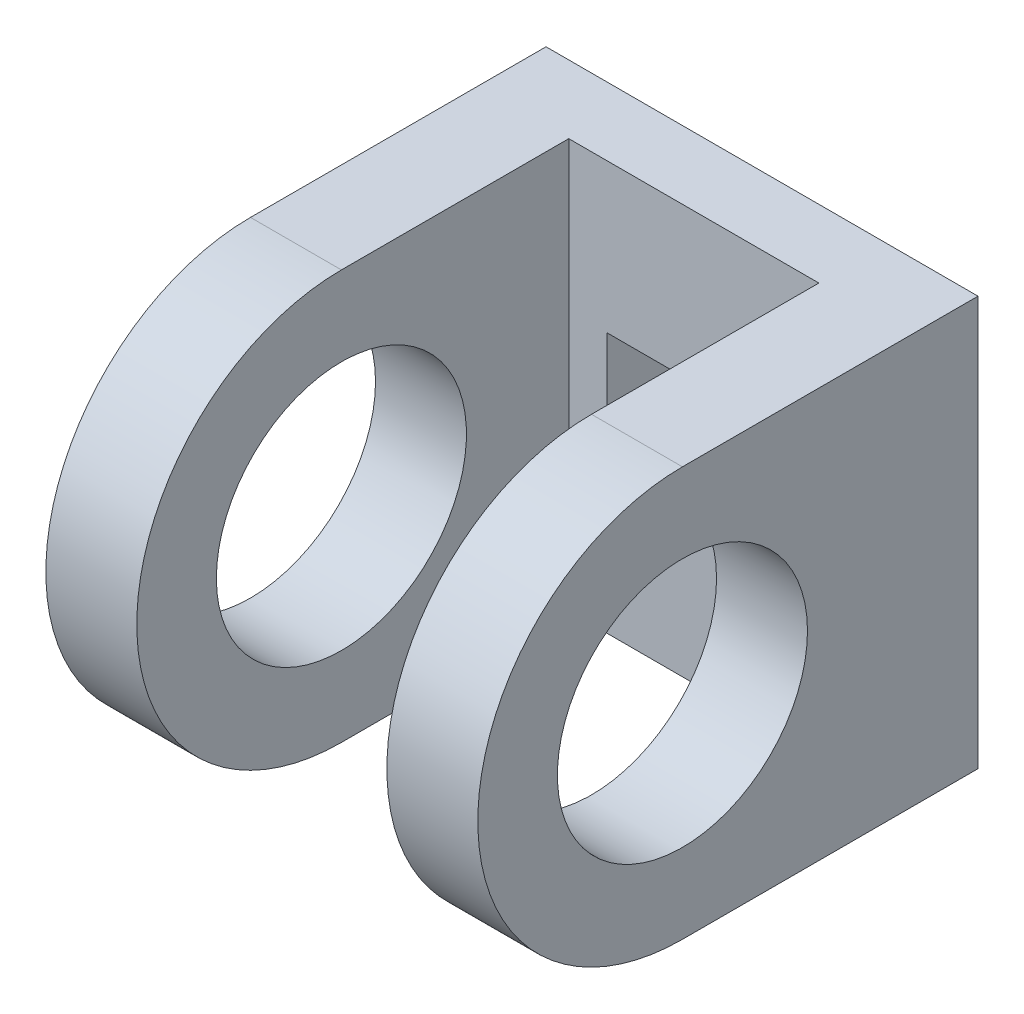
ISO-10303-21;
HEADER;
FILE_DESCRIPTION(('STEP AP214'),'2;1');
FILE_NAME('part.step','',(''),(''),'','','');
FILE_SCHEMA(('AUTOMOTIVE_DESIGN { 1 0 10303 214 1 1 1 1 }'));
ENDSEC;
DATA;
#1=APPLICATION_CONTEXT('core data for automotive mechanical design processes');
#2=APPLICATION_PROTOCOL_DEFINITION('international standard','automotive_design',2000,#1);
#3=PRODUCT_CONTEXT('',#1,'mechanical');
#4=PRODUCT('Part','Part','',(#3));
#5=PRODUCT_RELATED_PRODUCT_CATEGORY('part','',(#4));
#6=PRODUCT_DEFINITION_FORMATION('','',#4);
#7=PRODUCT_DEFINITION_CONTEXT('part definition',#1,'design');
#8=PRODUCT_DEFINITION('design','',#6,#7);
#9=PRODUCT_DEFINITION_SHAPE('','',#8);
#10=(LENGTH_UNIT() NAMED_UNIT(*) SI_UNIT(.MILLI.,.METRE.));
#11=(NAMED_UNIT(*) PLANE_ANGLE_UNIT() SI_UNIT($,.RADIAN.));
#12=(NAMED_UNIT(*) SI_UNIT($,.STERADIAN.) SOLID_ANGLE_UNIT());
#13=UNCERTAINTY_MEASURE_WITH_UNIT(LENGTH_MEASURE(1.E-05),#10,'distance_accuracy_value','');
#14=(GEOMETRIC_REPRESENTATION_CONTEXT(3) GLOBAL_UNCERTAINTY_ASSIGNED_CONTEXT((#13)) GLOBAL_UNIT_ASSIGNED_CONTEXT((#10,
#11,#12)) REPRESENTATION_CONTEXT('',''));
#15=CARTESIAN_POINT('',(0.,0.,0.));
#16=DIRECTION('',(0.,0.,1.));
#17=DIRECTION('',(1.,0.,0.));
#18=AXIS2_PLACEMENT_3D('',#15,#16,#17);
#19=CARTESIAN_POINT('',(19.,0.,1.99999952316284));
#20=DIRECTION('',(-1.,0.,0.));
#21=DIRECTION('',(0.,0.,1.));
#22=AXIS2_PLACEMENT_3D('',#19,#20,#21);
#23=CYLINDRICAL_SURFACE('',#22,9.00000095367432);
#24=CARTESIAN_POINT('',(4.,0.,1.99999952316284));
#25=DIRECTION('',(-1.,0.,0.));
#26=DIRECTION('',(0.,0.,1.));
#27=AXIS2_PLACEMENT_3D('',#24,#25,#26);
#28=CIRCLE('',#27,9.00000095367432);
#29=CARTESIAN_POINT('',(4.,-9.00000095367432,1.99999952316284));
#30=VERTEX_POINT('',#29);
#31=CARTESIAN_POINT('',(4.,9.00000095367431,1.99999952316284));
#32=VERTEX_POINT('',#31);
#33=EDGE_CURVE('E189',#30,#32,#28,.T.);
#34=ORIENTED_EDGE('',*,*,#33,.T.);
#35=DIRECTION('',(-1.,0.,0.));
#36=VECTOR('',#35,1.);
#37=CARTESIAN_POINT('',(19.,9.00000095367431,1.99999952316284));
#38=LINE('',#37,#36);
#39=CARTESIAN_POINT('',(0.,9.00000095367431,1.99999952316284));
#40=VERTEX_POINT('',#39);
#41=EDGE_CURVE('E211',#32,#40,#38,.T.);
#42=ORIENTED_EDGE('',*,*,#41,.T.);
#43=CARTESIAN_POINT('',(0.,0.,1.99999952316284));
#44=DIRECTION('',(1.,0.,0.));
#45=DIRECTION('',(0.,0.,1.));
#46=AXIS2_PLACEMENT_3D('',#43,#44,#45);
#47=CIRCLE('',#46,9.00000095367432);
#48=CARTESIAN_POINT('',(0.,-9.00000095367432,1.99999952316284));
#49=VERTEX_POINT('',#48);
#50=EDGE_CURVE('E198',#40,#49,#47,.T.);
#51=ORIENTED_EDGE('',*,*,#50,.T.);
#52=DIRECTION('',(-1.,0.,0.));
#53=VECTOR('',#52,1.);
#54=CARTESIAN_POINT('',(19.,-9.00000095367432,1.99999952316284));
#55=LINE('',#54,#53);
#56=EDGE_CURVE('E48',#30,#49,#55,.T.);
#57=ORIENTED_EDGE('',*,*,#56,.F.);
#58=EDGE_LOOP('',(#34,#42,#51,#57));
#59=FACE_BOUND('',#58,.T.);
#60=ADVANCED_FACE('F39',(#59),#23,.T.);
#61=CARTESIAN_POINT('',(19.,0.,1.99999952316284));
#62=DIRECTION('',(-1.,0.,0.));
#63=DIRECTION('',(0.,0.,1.));
#64=AXIS2_PLACEMENT_3D('',#61,#62,#63);
#65=CYLINDRICAL_SURFACE('',#64,5.49999903647999);
#66=CARTESIAN_POINT('',(4.,0.,1.99999952316284));
#67=DIRECTION('',(-1.,0.,0.));
#68=DIRECTION('',(0.,0.,1.));
#69=AXIS2_PLACEMENT_3D('',#66,#67,#68);
#70=CIRCLE('',#69,5.49999903647999);
#71=CARTESIAN_POINT('',(4.,0.,7.49999855964283));
#72=VERTEX_POINT('',#71);
#73=EDGE_CURVE('E43',#72,#72,#70,.T.);
#74=ORIENTED_EDGE('',*,*,#73,.F.);
#75=EDGE_LOOP('',(#74));
#76=FACE_BOUND('',#75,.T.);
#77=CARTESIAN_POINT('',(0.,0.,1.99999952316284));
#78=DIRECTION('',(1.,0.,0.));
#79=DIRECTION('',(0.,0.,-1.));
#80=AXIS2_PLACEMENT_3D('',#77,#78,#79);
#81=CIRCLE('',#80,5.49999903647999);
#82=CARTESIAN_POINT('',(0.,0.,-3.49999951331714));
#83=VERTEX_POINT('',#82);
#84=EDGE_CURVE('E194',#83,#83,#81,.T.);
#85=ORIENTED_EDGE('',*,*,#84,.F.);
#86=EDGE_LOOP('',(#85));
#87=FACE_BOUND('',#86,.T.);
#88=ADVANCED_FACE('F239',(#76,#87),#65,.F.);
#89=CARTESIAN_POINT('',(19.,0.,1.99999952316284));
#90=DIRECTION('',(-1.,0.,0.));
#91=DIRECTION('',(0.,0.,1.));
#92=AXIS2_PLACEMENT_3D('',#89,#90,#91);
#93=PLANE('',#92);
#94=CARTESIAN_POINT('',(19.,0.,1.99999952316284));
#95=DIRECTION('',(1.,0.,0.));
#96=DIRECTION('',(0.,0.,1.));
#97=AXIS2_PLACEMENT_3D('',#94,#95,#96);
#98=CIRCLE('',#97,9.00000095367432);
#99=CARTESIAN_POINT('',(19.,9.00000095367431,1.99999952316284));
#100=VERTEX_POINT('',#99);
#101=CARTESIAN_POINT('',(19.,-9.00000095367432,1.99999952316284));
#102=VERTEX_POINT('',#101);
#103=EDGE_CURVE('E201',#100,#102,#98,.T.);
#104=ORIENTED_EDGE('',*,*,#103,.T.);
#105=DIRECTION('',(0.,0.,-1.));
#106=VECTOR('',#105,1.);
#107=CARTESIAN_POINT('',(19.,-9.00000095367432,-11.0000004768372));
#108=LINE('',#107,#106);
#109=CARTESIAN_POINT('',(19.,-9.00000095367432,-11.0000004768372));
#110=VERTEX_POINT('',#109);
#111=EDGE_CURVE('E204',#102,#110,#108,.T.);
#112=ORIENTED_EDGE('',*,*,#111,.T.);
#113=DIRECTION('',(0.,1.,0.));
#114=VECTOR('',#113,1.);
#115=CARTESIAN_POINT('',(19.,9.00000095367431,-11.0000004768372));
#116=LINE('',#115,#114);
#117=CARTESIAN_POINT('',(19.,9.00000095367431,-11.0000004768372));
#118=VERTEX_POINT('',#117);
#119=EDGE_CURVE('E207',#110,#118,#116,.T.);
#120=ORIENTED_EDGE('',*,*,#119,.T.);
#121=DIRECTION('',(0.,0.,1.));
#122=VECTOR('',#121,1.);
#123=CARTESIAN_POINT('',(19.,9.00000095367431,1.99999952316284));
#124=LINE('',#123,#122);
#125=EDGE_CURVE('E209',#118,#100,#124,.T.);
#126=ORIENTED_EDGE('',*,*,#125,.T.);
#127=EDGE_LOOP('',(#104,#112,#120,#126));
#128=FACE_BOUND('',#127,.T.);
#129=CARTESIAN_POINT('',(19.,0.,1.99999952316284));
#130=DIRECTION('',(1.,0.,0.));
#131=DIRECTION('',(0.,0.,-1.));
#132=AXIS2_PLACEMENT_3D('',#129,#130,#131);
#133=CIRCLE('',#132,5.49999903647999);
#134=CARTESIAN_POINT('',(19.,0.,-3.49999951331714));
#135=VERTEX_POINT('',#134);
#136=EDGE_CURVE('E195',#135,#135,#133,.T.);
#137=ORIENTED_EDGE('',*,*,#136,.F.);
#138=EDGE_LOOP('',(#137));
#139=FACE_BOUND('',#138,.T.);
#140=ADVANCED_FACE('F242',(#128,#139),#93,.F.);
#141=CARTESIAN_POINT('',(0.,0.,1.99999952316284));
#142=DIRECTION('',(-1.,0.,0.));
#143=DIRECTION('',(0.,0.,1.));
#144=AXIS2_PLACEMENT_3D('',#141,#142,#143);
#145=PLANE('',#144);
#146=ORIENTED_EDGE('',*,*,#50,.F.);
#147=DIRECTION('',(0.,0.,1.));
#148=VECTOR('',#147,1.);
#149=CARTESIAN_POINT('',(0.,9.00000095367431,1.99999952316284));
#150=LINE('',#149,#148);
#151=CARTESIAN_POINT('',(0.,9.00000095367431,-11.0000004768372));
#152=VERTEX_POINT('',#151);
#153=EDGE_CURVE('E205',#152,#40,#150,.T.);
#154=ORIENTED_EDGE('',*,*,#153,.F.);
#155=DIRECTION('',(0.,1.,0.));
#156=VECTOR('',#155,1.);
#157=CARTESIAN_POINT('',(0.,9.00000095367431,-11.0000004768372));
#158=LINE('',#157,#156);
#159=CARTESIAN_POINT('',(0.,-9.00000095367432,-11.0000004768372));
#160=VERTEX_POINT('',#159);
#161=EDGE_CURVE('E216',#160,#152,#158,.T.);
#162=ORIENTED_EDGE('',*,*,#161,.F.);
#163=DIRECTION('',(0.,0.,-1.));
#164=VECTOR('',#163,1.);
#165=CARTESIAN_POINT('',(0.,-9.00000095367432,-11.0000004768372));
#166=LINE('',#165,#164);
#167=EDGE_CURVE('E214',#49,#160,#166,.T.);
#168=ORIENTED_EDGE('',*,*,#167,.F.);
#169=EDGE_LOOP('',(#146,#154,#162,#168));
#170=FACE_BOUND('',#169,.T.);
#171=ORIENTED_EDGE('',*,*,#84,.T.);
#172=EDGE_LOOP('',(#171));
#173=FACE_BOUND('',#172,.T.);
#174=ADVANCED_FACE('F244',(#170,#173),#145,.T.);
#175=CARTESIAN_POINT('',(15.,9.00000095367431,1.99999952316284));
#176=VERTEX_POINT('',#175);
#177=EDGE_CURVE('E220',#100,#176,#38,.T.);
#178=ORIENTED_EDGE('',*,*,#177,.T.);
#179=CARTESIAN_POINT('',(15.,0.,1.99999952316284));
#180=DIRECTION('',(1.,0.,0.));
#181=DIRECTION('',(0.,0.,-1.));
#182=AXIS2_PLACEMENT_3D('',#179,#180,#181);
#183=CIRCLE('',#182,9.00000095367432);
#184=CARTESIAN_POINT('',(15.,-9.00000095367432,1.99999952316284));
#185=VERTEX_POINT('',#184);
#186=EDGE_CURVE('E184',#176,#185,#183,.T.);
#187=ORIENTED_EDGE('',*,*,#186,.T.);
#188=EDGE_CURVE('E11',#102,#185,#55,.T.);
#189=ORIENTED_EDGE('',*,*,#188,.F.);
#190=ORIENTED_EDGE('',*,*,#103,.F.);
#191=EDGE_LOOP('',(#178,#187,#189,#190));
#192=FACE_BOUND('',#191,.T.);
#193=ADVANCED_FACE('F41',(#192),#23,.T.);
#194=CARTESIAN_POINT('',(19.,-9.00000095367432,-11.0000004768372));
#195=DIRECTION('',(0.,1.,0.));
#196=DIRECTION('',(0.,0.,1.));
#197=AXIS2_PLACEMENT_3D('',#194,#195,#196);
#198=PLANE('',#197);
#199=DIRECTION('',(-1.,0.,0.));
#200=VECTOR('',#199,1.);
#201=CARTESIAN_POINT('',(19.,-9.00000095367432,-7.99999952316284));
#202=LINE('',#201,#200);
#203=CARTESIAN_POINT('',(15.,-9.00000095367432,-7.99999952316284));
#204=VERTEX_POINT('',#203);
#205=CARTESIAN_POINT('',(4.,-9.00000095367432,-7.99999952316284));
#206=VERTEX_POINT('',#205);
#207=EDGE_CURVE('E191',#204,#206,#202,.T.);
#208=ORIENTED_EDGE('',*,*,#207,.T.);
#209=DIRECTION('',(0.,0.,1.));
#210=VECTOR('',#209,1.);
#211=CARTESIAN_POINT('',(4.,-9.00000095367432,-11.0000004768372));
#212=LINE('',#211,#210);
#213=EDGE_CURVE('E186',#206,#30,#212,.T.);
#214=ORIENTED_EDGE('',*,*,#213,.T.);
#215=ORIENTED_EDGE('',*,*,#56,.T.);
#216=ORIENTED_EDGE('',*,*,#167,.T.);
#217=DIRECTION('',(-1.,0.,0.));
#218=VECTOR('',#217,1.);
#219=CARTESIAN_POINT('',(19.,-9.00000095367432,-11.0000004768372));
#220=LINE('',#219,#218);
#221=EDGE_CURVE('E226',#110,#160,#220,.T.);
#222=ORIENTED_EDGE('',*,*,#221,.F.);
#223=ORIENTED_EDGE('',*,*,#111,.F.);
#224=ORIENTED_EDGE('',*,*,#188,.T.);
#225=DIRECTION('',(0.,0.,-1.));
#226=VECTOR('',#225,1.);
#227=CARTESIAN_POINT('',(15.,-9.00000095367432,-11.0000004768372));
#228=LINE('',#227,#226);
#229=EDGE_CURVE('E181',#185,#204,#228,.T.);
#230=ORIENTED_EDGE('',*,*,#229,.T.);
#231=EDGE_LOOP('',(#208,#214,#215,#216,#222,#223,#224,#230));
#232=FACE_BOUND('',#231,.T.);
#233=ADVANCED_FACE('F259',(#232),#198,.F.);
#234=CARTESIAN_POINT('',(19.,9.00000095367431,-11.0000004768372));
#235=DIRECTION('',(0.,0.,1.));
#236=DIRECTION('',(0.,-1.,0.));
#237=AXIS2_PLACEMENT_3D('',#234,#235,#236);
#238=PLANE('',#237);
#239=DIRECTION('',(-1.,0.,0.));
#240=VECTOR('',#239,1.);
#241=CARTESIAN_POINT('',(19.,2.44641040240358,-11.0000004768372));
#242=LINE('',#241,#240);
#243=CARTESIAN_POINT('',(13.2754317919568,2.44641040240358,-11.0000004768372));
#244=VERTEX_POINT('',#243);
#245=CARTESIAN_POINT('',(5.67718650457361,2.44641040240358,-11.0000004768372));
#246=VERTEX_POINT('',#245);
#247=EDGE_CURVE('E161',#244,#246,#242,.T.);
#248=ORIENTED_EDGE('',*,*,#247,.T.);
#249=DIRECTION('',(0.,-1.,0.));
#250=VECTOR('',#249,1.);
#251=CARTESIAN_POINT('',(5.67718650457362,9.00000095367432,-11.0000004768372));
#252=LINE('',#251,#250);
#253=CARTESIAN_POINT('',(5.67718650457361,-2.47010125413847,-11.0000004768372));
#254=VERTEX_POINT('',#253);
#255=EDGE_CURVE('E164',#246,#254,#252,.T.);
#256=ORIENTED_EDGE('',*,*,#255,.T.);
#257=DIRECTION('',(1.,0.,0.));
#258=VECTOR('',#257,1.);
#259=CARTESIAN_POINT('',(19.,-2.47010125413847,-11.0000004768372));
#260=LINE('',#259,#258);
#261=CARTESIAN_POINT('',(13.2754317919568,-2.47010125413847,-11.0000004768372));
#262=VERTEX_POINT('',#261);
#263=EDGE_CURVE('E156',#254,#262,#260,.T.);
#264=ORIENTED_EDGE('',*,*,#263,.T.);
#265=DIRECTION('',(0.,1.,0.));
#266=VECTOR('',#265,1.);
#267=CARTESIAN_POINT('',(13.2754317919568,9.00000095367431,-11.0000004768372));
#268=LINE('',#267,#266);
#269=EDGE_CURVE('E136',#262,#244,#268,.T.);
#270=ORIENTED_EDGE('',*,*,#269,.T.);
#271=EDGE_LOOP('',(#248,#256,#264,#270));
#272=FACE_BOUND('',#271,.T.);
#273=ORIENTED_EDGE('',*,*,#161,.T.);
#274=DIRECTION('',(-1.,0.,0.));
#275=VECTOR('',#274,1.);
#276=CARTESIAN_POINT('',(19.,9.00000095367431,-11.0000004768372));
#277=LINE('',#276,#275);
#278=EDGE_CURVE('E223',#118,#152,#277,.T.);
#279=ORIENTED_EDGE('',*,*,#278,.F.);
#280=ORIENTED_EDGE('',*,*,#119,.F.);
#281=ORIENTED_EDGE('',*,*,#221,.T.);
#282=EDGE_LOOP('',(#273,#279,#280,#281));
#283=FACE_BOUND('',#282,.T.);
#284=ADVANCED_FACE('F264',(#272,#283),#238,.F.);
#285=CARTESIAN_POINT('',(19.,9.00000095367431,1.99999952316284));
#286=DIRECTION('',(0.,-1.,0.));
#287=DIRECTION('',(0.,0.,-1.));
#288=AXIS2_PLACEMENT_3D('',#285,#286,#287);
#289=PLANE('',#288);
#290=ORIENTED_EDGE('',*,*,#41,.F.);
#291=DIRECTION('',(0.,0.,1.));
#292=VECTOR('',#291,1.);
#293=CARTESIAN_POINT('',(4.,9.00000095367431,11.0000004768372));
#294=LINE('',#293,#292);
#295=CARTESIAN_POINT('',(4.,9.00000095367431,-7.99999952316284));
#296=VERTEX_POINT('',#295);
#297=EDGE_CURVE('E167',#296,#32,#294,.T.);
#298=ORIENTED_EDGE('',*,*,#297,.F.);
#299=DIRECTION('',(-1.,0.,0.));
#300=VECTOR('',#299,1.);
#301=CARTESIAN_POINT('',(4.,9.00000095367431,-7.99999952316284));
#302=LINE('',#301,#300);
#303=CARTESIAN_POINT('',(15.,9.00000095367431,-7.99999952316284));
#304=VERTEX_POINT('',#303);
#305=EDGE_CURVE('E173',#304,#296,#302,.T.);
#306=ORIENTED_EDGE('',*,*,#305,.F.);
#307=DIRECTION('',(0.,0.,-1.));
#308=VECTOR('',#307,1.);
#309=CARTESIAN_POINT('',(15.,9.00000095367431,11.0000004768372));
#310=LINE('',#309,#308);
#311=EDGE_CURVE('E170',#176,#304,#310,.T.);
#312=ORIENTED_EDGE('',*,*,#311,.F.);
#313=ORIENTED_EDGE('',*,*,#177,.F.);
#314=ORIENTED_EDGE('',*,*,#125,.F.);
#315=ORIENTED_EDGE('',*,*,#278,.T.);
#316=ORIENTED_EDGE('',*,*,#153,.T.);
#317=EDGE_LOOP('',(#290,#298,#306,#312,#313,#314,#315,#316));
#318=FACE_BOUND('',#317,.T.);
#319=ADVANCED_FACE('F237',(#318),#289,.F.);
#320=CARTESIAN_POINT('',(15.,0.,1.99999952316284));
#321=DIRECTION('',(1.,0.,0.));
#322=DIRECTION('',(0.,0.,-1.));
#323=AXIS2_PLACEMENT_3D('',#320,#321,#322);
#324=CIRCLE('',#323,5.49999903647999);
#325=CARTESIAN_POINT('',(15.,0.,-3.49999951331714));
#326=VERTEX_POINT('',#325);
#327=EDGE_CURVE('E179',#326,#326,#324,.T.);
#328=ORIENTED_EDGE('',*,*,#327,.F.);
#329=EDGE_LOOP('',(#328));
#330=FACE_BOUND('',#329,.T.);
#331=ORIENTED_EDGE('',*,*,#136,.T.);
#332=EDGE_LOOP('',(#331));
#333=FACE_BOUND('',#332,.T.);
#334=ADVANCED_FACE('F234',(#330,#333),#65,.F.);
#335=CARTESIAN_POINT('',(4.,-23.9999990463257,-7.99999952316284));
#336=DIRECTION('',(0.,0.,-1.));
#337=DIRECTION('',(-1.,0.,0.));
#338=AXIS2_PLACEMENT_3D('',#335,#336,#337);
#339=PLANE('',#338);
#340=DIRECTION('',(1.,0.,0.));
#341=VECTOR('',#340,1.);
#342=CARTESIAN_POINT('',(5.67718650457361,-2.47010125413847,-7.99999952316284));
#343=LINE('',#342,#341);
#344=CARTESIAN_POINT('',(5.67718650457361,-2.47010125413847,-7.99999952316284));
#345=VERTEX_POINT('',#344);
#346=CARTESIAN_POINT('',(13.2754317919568,-2.47010125413847,-7.99999952316284));
#347=VERTEX_POINT('',#346);
#348=EDGE_CURVE('E142',#345,#347,#343,.T.);
#349=ORIENTED_EDGE('',*,*,#348,.F.);
#350=DIRECTION('',(0.,-1.,0.));
#351=VECTOR('',#350,1.);
#352=CARTESIAN_POINT('',(5.67718650457361,2.44641040240358,-7.99999952316284));
#353=LINE('',#352,#351);
#354=CARTESIAN_POINT('',(5.67718650457361,2.44641040240358,-7.99999952316284));
#355=VERTEX_POINT('',#354);
#356=EDGE_CURVE('E64',#355,#345,#353,.T.);
#357=ORIENTED_EDGE('',*,*,#356,.F.);
#358=DIRECTION('',(-1.,0.,0.));
#359=VECTOR('',#358,1.);
#360=CARTESIAN_POINT('',(5.67718650457361,2.44641040240358,-7.99999952316284));
#361=LINE('',#360,#359);
#362=CARTESIAN_POINT('',(13.2754317919568,2.44641040240358,-7.99999952316284));
#363=VERTEX_POINT('',#362);
#364=EDGE_CURVE('E149',#363,#355,#361,.T.);
#365=ORIENTED_EDGE('',*,*,#364,.F.);
#366=DIRECTION('',(0.,1.,0.));
#367=VECTOR('',#366,1.);
#368=CARTESIAN_POINT('',(13.2754317919568,2.44641040240358,-7.99999952316284));
#369=LINE('',#368,#367);
#370=EDGE_CURVE('E133',#347,#363,#369,.T.);
#371=ORIENTED_EDGE('',*,*,#370,.F.);
#372=EDGE_LOOP('',(#349,#357,#365,#371));
#373=FACE_BOUND('',#372,.T.);
#374=DIRECTION('',(0.,1.,0.));
#375=VECTOR('',#374,1.);
#376=CARTESIAN_POINT('',(15.,-23.9999990463257,-7.99999952316284));
#377=LINE('',#376,#375);
#378=EDGE_CURVE('E176',#204,#304,#377,.T.);
#379=ORIENTED_EDGE('',*,*,#378,.T.);
#380=ORIENTED_EDGE('',*,*,#305,.T.);
#381=DIRECTION('',(0.,1.,0.));
#382=VECTOR('',#381,1.);
#383=CARTESIAN_POINT('',(4.,-23.9999990463257,-7.99999952316284));
#384=LINE('',#383,#382);
#385=EDGE_CURVE('E177',#206,#296,#384,.T.);
#386=ORIENTED_EDGE('',*,*,#385,.F.);
#387=ORIENTED_EDGE('',*,*,#207,.F.);
#388=EDGE_LOOP('',(#379,#380,#386,#387));
#389=FACE_BOUND('',#388,.T.);
#390=ADVANCED_FACE('F146',(#373,#389),#339,.F.);
#391=CARTESIAN_POINT('',(4.,-23.9999990463257,11.0000004768372));
#392=DIRECTION('',(-1.,0.,0.));
#393=DIRECTION('',(0.,0.,1.));
#394=AXIS2_PLACEMENT_3D('',#391,#392,#393);
#395=PLANE('',#394);
#396=ORIENTED_EDGE('',*,*,#73,.T.);
#397=EDGE_LOOP('',(#396));
#398=FACE_BOUND('',#397,.T.);
#399=ORIENTED_EDGE('',*,*,#33,.F.);
#400=ORIENTED_EDGE('',*,*,#213,.F.);
#401=ORIENTED_EDGE('',*,*,#385,.T.);
#402=ORIENTED_EDGE('',*,*,#297,.T.);
#403=EDGE_LOOP('',(#399,#400,#401,#402));
#404=FACE_BOUND('',#403,.T.);
#405=ADVANCED_FACE('F288',(#398,#404),#395,.F.);
#406=CARTESIAN_POINT('',(15.,-23.9999990463257,11.0000004768372));
#407=DIRECTION('',(1.,0.,0.));
#408=DIRECTION('',(0.,0.,-1.));
#409=AXIS2_PLACEMENT_3D('',#406,#407,#408);
#410=PLANE('',#409);
#411=ORIENTED_EDGE('',*,*,#327,.T.);
#412=EDGE_LOOP('',(#411));
#413=FACE_BOUND('',#412,.T.);
#414=ORIENTED_EDGE('',*,*,#311,.T.);
#415=ORIENTED_EDGE('',*,*,#378,.F.);
#416=ORIENTED_EDGE('',*,*,#229,.F.);
#417=ORIENTED_EDGE('',*,*,#186,.F.);
#418=EDGE_LOOP('',(#414,#415,#416,#417));
#419=FACE_BOUND('',#418,.T.);
#420=ADVANCED_FACE('F231',(#413,#419),#410,.F.);
#421=CARTESIAN_POINT('',(5.67718650457361,2.44641040240358,-40.9999995231628));
#422=DIRECTION('',(-1.,0.,0.));
#423=DIRECTION('',(0.,-1.,0.));
#424=AXIS2_PLACEMENT_3D('',#421,#422,#423);
#425=PLANE('',#424);
#426=DIRECTION('',(0.,0.,1.));
#427=VECTOR('',#426,1.);
#428=CARTESIAN_POINT('',(5.67718650457361,2.44641040240358,-40.9999995231628));
#429=LINE('',#428,#427);
#430=EDGE_CURVE('E154',#246,#355,#429,.T.);
#431=ORIENTED_EDGE('',*,*,#430,.T.);
#432=ORIENTED_EDGE('',*,*,#356,.T.);
#433=DIRECTION('',(0.,0.,1.));
#434=VECTOR('',#433,1.);
#435=CARTESIAN_POINT('',(5.67718650457361,-2.47010125413847,-40.9999995231628));
#436=LINE('',#435,#434);
#437=EDGE_CURVE('E139',#254,#345,#436,.T.);
#438=ORIENTED_EDGE('',*,*,#437,.F.);
#439=ORIENTED_EDGE('',*,*,#255,.F.);
#440=EDGE_LOOP('',(#431,#432,#438,#439));
#441=FACE_BOUND('',#440,.T.);
#442=ADVANCED_FACE('F301',(#441),#425,.F.);
#443=CARTESIAN_POINT('',(5.67718650457361,2.44641040240358,-40.9999995231628));
#444=DIRECTION('',(0.,1.,0.));
#445=DIRECTION('',(-1.,0.,0.));
#446=AXIS2_PLACEMENT_3D('',#443,#444,#445);
#447=PLANE('',#446);
#448=DIRECTION('',(0.,0.,1.));
#449=VECTOR('',#448,1.);
#450=CARTESIAN_POINT('',(13.2754317919568,2.44641040240358,-40.9999995231628));
#451=LINE('',#450,#449);
#452=EDGE_CURVE('E138',#244,#363,#451,.T.);
#453=ORIENTED_EDGE('',*,*,#452,.T.);
#454=ORIENTED_EDGE('',*,*,#364,.T.);
#455=ORIENTED_EDGE('',*,*,#430,.F.);
#456=ORIENTED_EDGE('',*,*,#247,.F.);
#457=EDGE_LOOP('',(#453,#454,#455,#456));
#458=FACE_BOUND('',#457,.T.);
#459=ADVANCED_FACE('F306',(#458),#447,.F.);
#460=CARTESIAN_POINT('',(13.2754317919568,2.44641040240358,-40.9999995231628));
#461=DIRECTION('',(1.,0.,0.));
#462=DIRECTION('',(0.,1.,0.));
#463=AXIS2_PLACEMENT_3D('',#460,#461,#462);
#464=PLANE('',#463);
#465=DIRECTION('',(0.,0.,1.));
#466=VECTOR('',#465,1.);
#467=CARTESIAN_POINT('',(13.2754317919568,-2.47010125413847,-40.9999995231628));
#468=LINE('',#467,#466);
#469=EDGE_CURVE('E56',#262,#347,#468,.T.);
#470=ORIENTED_EDGE('',*,*,#469,.T.);
#471=ORIENTED_EDGE('',*,*,#370,.T.);
#472=ORIENTED_EDGE('',*,*,#452,.F.);
#473=ORIENTED_EDGE('',*,*,#269,.F.);
#474=EDGE_LOOP('',(#470,#471,#472,#473));
#475=FACE_BOUND('',#474,.T.);
#476=ADVANCED_FACE('F130',(#475),#464,.F.);
#477=CARTESIAN_POINT('',(5.67718650457361,-2.47010125413847,-40.9999995231628));
#478=DIRECTION('',(0.,-1.,0.));
#479=DIRECTION('',(1.,0.,0.));
#480=AXIS2_PLACEMENT_3D('',#477,#478,#479);
#481=PLANE('',#480);
#482=ORIENTED_EDGE('',*,*,#437,.T.);
#483=ORIENTED_EDGE('',*,*,#348,.T.);
#484=ORIENTED_EDGE('',*,*,#469,.F.);
#485=ORIENTED_EDGE('',*,*,#263,.F.);
#486=EDGE_LOOP('',(#482,#483,#484,#485));
#487=FACE_BOUND('',#486,.T.);
#488=ADVANCED_FACE('F143',(#487),#481,.F.);
#489=CLOSED_SHELL('',(#60,#88,#140,#174,#193,#233,#284,#319,#334,#390,#405,#420,#442,#459,#476,#488));
#490=MANIFOLD_SOLID_BREP('B2',#489);
#491=ADVANCED_BREP_SHAPE_REPRESENTATION('',(#18,#490),#14);
#492=SHAPE_DEFINITION_REPRESENTATION(#9,#491);
ENDSEC;
END-ISO-10303-21;
